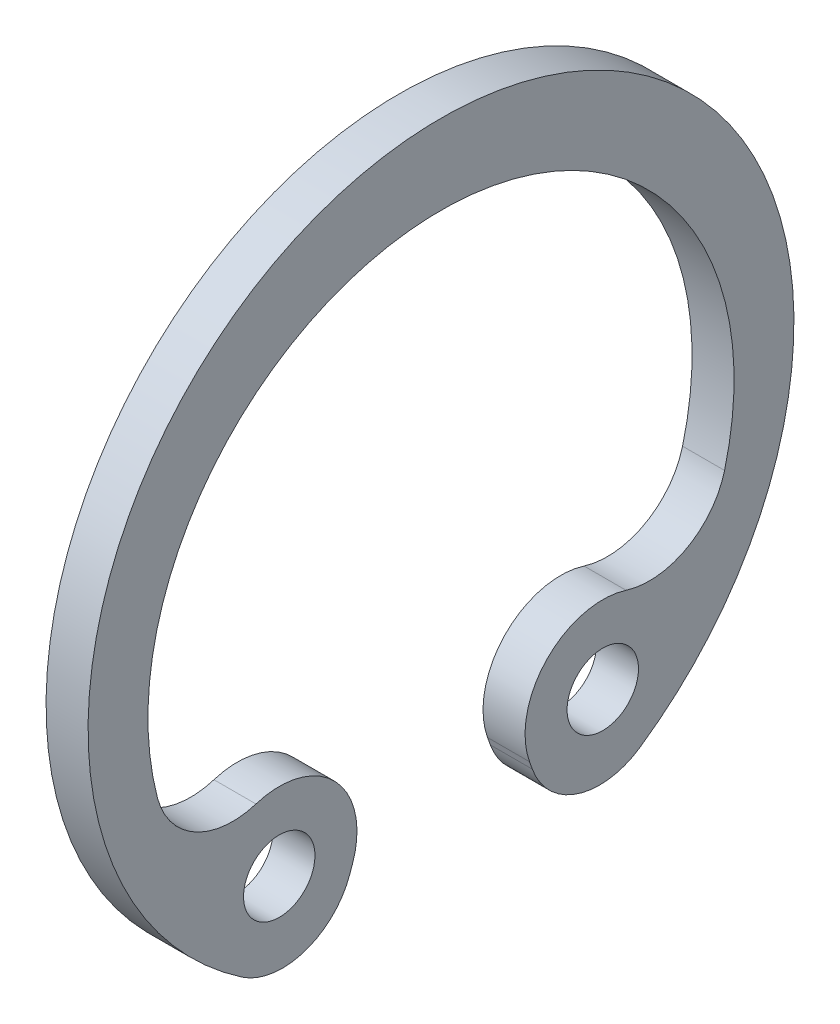
ISO-10303-21;
HEADER;
FILE_DESCRIPTION(('STEP AP214'),'2;1');
FILE_NAME('part.step','',(''),(''),'','','');
FILE_SCHEMA(('AUTOMOTIVE_DESIGN { 1 0 10303 214 1 1 1 1 }'));
ENDSEC;
DATA;
#1=APPLICATION_CONTEXT('core data for automotive mechanical design processes');
#2=APPLICATION_PROTOCOL_DEFINITION('international standard','automotive_design',2000,#1);
#3=PRODUCT_CONTEXT('',#1,'mechanical');
#4=PRODUCT('Part','Part','',(#3));
#5=PRODUCT_RELATED_PRODUCT_CATEGORY('part','',(#4));
#6=PRODUCT_DEFINITION_FORMATION('','',#4);
#7=PRODUCT_DEFINITION_CONTEXT('part definition',#1,'design');
#8=PRODUCT_DEFINITION('design','',#6,#7);
#9=PRODUCT_DEFINITION_SHAPE('','',#8);
#10=(LENGTH_UNIT() NAMED_UNIT(*) SI_UNIT(.MILLI.,.METRE.));
#11=(NAMED_UNIT(*) PLANE_ANGLE_UNIT() SI_UNIT($,.RADIAN.));
#12=(NAMED_UNIT(*) SI_UNIT($,.STERADIAN.) SOLID_ANGLE_UNIT());
#13=UNCERTAINTY_MEASURE_WITH_UNIT(LENGTH_MEASURE(1.E-05),#10,'distance_accuracy_value','');
#14=(GEOMETRIC_REPRESENTATION_CONTEXT(3) GLOBAL_UNCERTAINTY_ASSIGNED_CONTEXT((#13)) GLOBAL_UNIT_ASSIGNED_CONTEXT((#10,
#11,#12)) REPRESENTATION_CONTEXT('',''));
#15=CARTESIAN_POINT('',(0.,0.,0.));
#16=DIRECTION('',(0.,0.,1.));
#17=DIRECTION('',(1.,0.,0.));
#18=AXIS2_PLACEMENT_3D('',#15,#16,#17);
#19=CARTESIAN_POINT('',(0.5,-5.53535632287107,-3.77489475069846));
#20=DIRECTION('',(1.,0.,0.));
#21=DIRECTION('',(0.,0.,-1.));
#22=AXIS2_PLACEMENT_3D('',#19,#20,#21);
#23=PLANE('',#22);
#24=CARTESIAN_POINT('',(0.5,-5.29905651979667,-3.84999999999992));
#25=DIRECTION('',(1.,0.,0.));
#26=DIRECTION('',(0.,0.,-1.));
#27=AXIS2_PLACEMENT_3D('',#24,#25,#26);
#28=CIRCLE('',#27,0.85000000000008);
#29=CARTESIAN_POINT('',(0.5,-5.29905651979667,-4.7));
#30=VERTEX_POINT('',#29);
#31=EDGE_CURVE('E160',#30,#30,#28,.T.);
#32=ORIENTED_EDGE('',*,*,#31,.F.);
#33=EDGE_LOOP('',(#32));
#34=FACE_BOUND('',#33,.T.);
#35=CARTESIAN_POINT('',(0.5,-5.53535632287107,-3.77489475069846));
#36=DIRECTION('',(1.,0.,0.));
#37=DIRECTION('',(0.,0.,-1.));
#38=AXIS2_PLACEMENT_3D('',#35,#36,#37);
#39=CIRCLE('',#38,1.70000000000005);
#40=CARTESIAN_POINT('',(0.5,-6.1054568820179,-2.1733375857928));
#41=VERTEX_POINT('',#40);
#42=CARTESIAN_POINT('',(0.5,-6.9398497182265,-4.7327038665473));
#43=VERTEX_POINT('',#42);
#44=EDGE_CURVE('E163',#41,#43,#39,.T.);
#45=ORIENTED_EDGE('',*,*,#44,.T.);
#46=CARTESIAN_POINT('',(0.5,0.,0.));
#47=DIRECTION('',(1.,0.,0.));
#48=DIRECTION('',(0.,0.,-1.));
#49=AXIS2_PLACEMENT_3D('',#46,#47,#48);
#50=CIRCLE('',#49,8.40000000000001);
#51=CARTESIAN_POINT('',(0.5,-6.9398497182265,4.7327038665473));
#52=VERTEX_POINT('',#51);
#53=EDGE_CURVE('E113',#43,#52,#50,.T.);
#54=ORIENTED_EDGE('',*,*,#53,.T.);
#55=CARTESIAN_POINT('',(0.5,-5.53535632287107,3.77489475069846));
#56=DIRECTION('',(1.,0.,0.));
#57=DIRECTION('',(0.,0.,-1.));
#58=AXIS2_PLACEMENT_3D('',#55,#56,#57);
#59=CIRCLE('',#58,1.70000000000005);
#60=CARTESIAN_POINT('',(0.5,-6.1054568820179,2.1733375857928));
#61=VERTEX_POINT('',#60);
#62=EDGE_CURVE('E166',#52,#61,#59,.T.);
#63=ORIENTED_EDGE('',*,*,#62,.T.);
#64=DIRECTION('',(0.,0.9420924499444,-0.335353270086573));
#65=VECTOR('',#64,1.);
#66=CARTESIAN_POINT('',(0.5,-6.1054568820179,2.1733375857928));
#67=LINE('',#66,#65);
#68=CARTESIAN_POINT('',(0.5,-5.9194600694565,2.1071289676027));
#69=VERTEX_POINT('',#68);
#70=EDGE_CURVE('E168',#61,#69,#67,.T.);
#71=ORIENTED_EDGE('',*,*,#70,.T.);
#72=CARTESIAN_POINT('',(0.5,-5.29905651979667,3.84999999999992));
#73=DIRECTION('',(1.,0.,0.));
#74=DIRECTION('',(0.,0.,-1.));
#75=AXIS2_PLACEMENT_3D('',#72,#73,#74);
#76=CIRCLE('',#75,1.84999999999997);
#77=CARTESIAN_POINT('',(0.5,-3.5340982980784,4.4044569195067));
#78=VERTEX_POINT('',#77);
#79=EDGE_CURVE('E170',#69,#78,#76,.T.);
#80=ORIENTED_EDGE('',*,*,#79,.T.);
#81=CARTESIAN_POINT('',(0.5,-1.76914007636022,4.95891383901346));
#82=DIRECTION('',(-1.,0.,0.));
#83=DIRECTION('',(0.,0.,1.));
#84=AXIS2_PLACEMENT_3D('',#81,#82,#83);
#85=CIRCLE('',#84,1.84999999999987);
#86=CARTESIAN_POINT('',(0.5,-2.2362930795339,6.7489607857792));
#87=VERTEX_POINT('',#86);
#88=EDGE_CURVE('E172',#78,#87,#85,.T.);
#89=ORIENTED_EDGE('',*,*,#88,.T.);
#90=CARTESIAN_POINT('',(0.5,-0.474999999999967,0.));
#91=DIRECTION('',(-1.,0.,0.));
#92=DIRECTION('',(0.,0.,1.));
#93=AXIS2_PLACEMENT_3D('',#90,#91,#92);
#94=CIRCLE('',#93,6.97499999999997);
#95=CARTESIAN_POINT('',(0.5,-2.2362930795339,-6.7489607857792));
#96=VERTEX_POINT('',#95);
#97=EDGE_CURVE('E174',#87,#96,#94,.T.);
#98=ORIENTED_EDGE('',*,*,#97,.T.);
#99=CARTESIAN_POINT('',(0.5,-1.76914007636021,-4.95891383901346));
#100=DIRECTION('',(-1.,0.,0.));
#101=DIRECTION('',(0.,0.,1.));
#102=AXIS2_PLACEMENT_3D('',#99,#100,#101);
#103=CIRCLE('',#102,1.84999999999988);
#104=CARTESIAN_POINT('',(0.5,-3.5340983241193,-4.4044570024006));
#105=VERTEX_POINT('',#104);
#106=EDGE_CURVE('E176',#96,#105,#103,.T.);
#107=ORIENTED_EDGE('',*,*,#106,.T.);
#108=CARTESIAN_POINT('',(0.5,-5.29905651979667,-3.84999999999992));
#109=DIRECTION('',(1.,0.,0.));
#110=DIRECTION('',(0.,0.,-1.));
#111=AXIS2_PLACEMENT_3D('',#108,#109,#110);
#112=CIRCLE('',#111,1.84999999999996);
#113=CARTESIAN_POINT('',(0.5,-5.9194600694565,-2.1071289676027));
#114=VERTEX_POINT('',#113);
#115=EDGE_CURVE('E53',#105,#114,#112,.T.);
#116=ORIENTED_EDGE('',*,*,#115,.T.);
#117=DIRECTION('',(0.,-0.9420924499444,-0.335353270086573));
#118=VECTOR('',#117,1.);
#119=CARTESIAN_POINT('',(0.5,-5.9194600694565,-2.1071289676027));
#120=LINE('',#119,#118);
#121=EDGE_CURVE('E48',#114,#41,#120,.T.);
#122=ORIENTED_EDGE('',*,*,#121,.T.);
#123=EDGE_LOOP('',(#45,#54,#63,#71,#80,#89,#98,#107,#116,#122));
#124=FACE_BOUND('',#123,.T.);
#125=CARTESIAN_POINT('',(0.5,-5.29905651979667,3.84999999999992));
#126=DIRECTION('',(1.,0.,0.));
#127=DIRECTION('',(0.,0.,-1.));
#128=AXIS2_PLACEMENT_3D('',#125,#126,#127);
#129=CIRCLE('',#128,0.849999999999921);
#130=CARTESIAN_POINT('',(0.5,-5.29905651979667,3.));
#131=VERTEX_POINT('',#130);
#132=EDGE_CURVE('E157',#131,#131,#129,.T.);
#133=ORIENTED_EDGE('',*,*,#132,.F.);
#134=EDGE_LOOP('',(#133));
#135=FACE_BOUND('',#134,.T.);
#136=ADVANCED_FACE('F33',(#34,#124,#135),#23,.T.);
#137=CARTESIAN_POINT('',(0.5,-5.53535632287107,-3.77489475069846));
#138=DIRECTION('',(-1.,0.,0.));
#139=DIRECTION('',(0.,0.,1.));
#140=AXIS2_PLACEMENT_3D('',#137,#138,#139);
#141=CYLINDRICAL_SURFACE('',#140,1.70000000000005);
#142=DIRECTION('',(-1.,0.,0.));
#143=VECTOR('',#142,1.);
#144=CARTESIAN_POINT('',(0.5,-6.1054568820179,-2.1733375857928));
#145=LINE('',#144,#143);
#146=CARTESIAN_POINT('',(-0.5,-6.1054568820179,-2.1733375857928));
#147=VERTEX_POINT('',#146);
#148=EDGE_CURVE('E128',#41,#147,#145,.T.);
#149=ORIENTED_EDGE('',*,*,#148,.T.);
#150=CARTESIAN_POINT('',(-0.5,-5.53535632287107,-3.77489475069846));
#151=DIRECTION('',(1.,0.,0.));
#152=DIRECTION('',(0.,0.,-1.));
#153=AXIS2_PLACEMENT_3D('',#150,#151,#152);
#154=CIRCLE('',#153,1.70000000000005);
#155=CARTESIAN_POINT('',(-0.5,-6.9398497182265,-4.7327038665473));
#156=VERTEX_POINT('',#155);
#157=EDGE_CURVE('E122',#147,#156,#154,.T.);
#158=ORIENTED_EDGE('',*,*,#157,.T.);
#159=DIRECTION('',(-1.,0.,0.));
#160=VECTOR('',#159,1.);
#161=CARTESIAN_POINT('',(0.5,-6.9398497182265,-4.7327038665473));
#162=LINE('',#161,#160);
#163=EDGE_CURVE('E11',#43,#156,#162,.T.);
#164=ORIENTED_EDGE('',*,*,#163,.F.);
#165=ORIENTED_EDGE('',*,*,#44,.F.);
#166=EDGE_LOOP('',(#149,#158,#164,#165));
#167=FACE_BOUND('',#166,.T.);
#168=ADVANCED_FACE('F35',(#167),#141,.T.);
#169=CARTESIAN_POINT('',(0.5,0.,0.));
#170=DIRECTION('',(-1.,0.,0.));
#171=DIRECTION('',(0.,0.,1.));
#172=AXIS2_PLACEMENT_3D('',#169,#170,#171);
#173=CYLINDRICAL_SURFACE('',#172,8.40000000000001);
#174=ORIENTED_EDGE('',*,*,#163,.T.);
#175=CARTESIAN_POINT('',(-0.5,0.,0.));
#176=DIRECTION('',(1.,0.,0.));
#177=DIRECTION('',(0.,0.,-1.));
#178=AXIS2_PLACEMENT_3D('',#175,#176,#177);
#179=CIRCLE('',#178,8.40000000000001);
#180=CARTESIAN_POINT('',(-0.5,-6.9398497182265,4.7327038665473));
#181=VERTEX_POINT('',#180);
#182=EDGE_CURVE('E112',#156,#181,#179,.T.);
#183=ORIENTED_EDGE('',*,*,#182,.T.);
#184=DIRECTION('',(-1.,0.,0.));
#185=VECTOR('',#184,1.);
#186=CARTESIAN_POINT('',(0.5,-6.9398497182265,4.7327038665473));
#187=LINE('',#186,#185);
#188=EDGE_CURVE('E41',#52,#181,#187,.T.);
#189=ORIENTED_EDGE('',*,*,#188,.F.);
#190=ORIENTED_EDGE('',*,*,#53,.F.);
#191=EDGE_LOOP('',(#174,#183,#189,#190));
#192=FACE_BOUND('',#191,.T.);
#193=ADVANCED_FACE('F110',(#192),#173,.T.);
#194=CARTESIAN_POINT('',(0.5,-5.53535632287107,3.77489475069846));
#195=DIRECTION('',(-1.,0.,0.));
#196=DIRECTION('',(0.,0.,1.));
#197=AXIS2_PLACEMENT_3D('',#194,#195,#196);
#198=CYLINDRICAL_SURFACE('',#197,1.70000000000005);
#199=ORIENTED_EDGE('',*,*,#188,.T.);
#200=CARTESIAN_POINT('',(-0.5,-5.53535632287107,3.77489475069846));
#201=DIRECTION('',(1.,0.,0.));
#202=DIRECTION('',(0.,0.,-1.));
#203=AXIS2_PLACEMENT_3D('',#200,#201,#202);
#204=CIRCLE('',#203,1.70000000000005);
#205=CARTESIAN_POINT('',(-0.5,-6.1054568820179,2.1733375857928));
#206=VERTEX_POINT('',#205);
#207=EDGE_CURVE('E126',#181,#206,#204,.T.);
#208=ORIENTED_EDGE('',*,*,#207,.T.);
#209=DIRECTION('',(-1.,0.,0.));
#210=VECTOR('',#209,1.);
#211=CARTESIAN_POINT('',(0.5,-6.1054568820179,2.1733375857928));
#212=LINE('',#211,#210);
#213=EDGE_CURVE('E193',#61,#206,#212,.T.);
#214=ORIENTED_EDGE('',*,*,#213,.F.);
#215=ORIENTED_EDGE('',*,*,#62,.F.);
#216=EDGE_LOOP('',(#199,#208,#214,#215));
#217=FACE_BOUND('',#216,.T.);
#218=ADVANCED_FACE('F196',(#217),#198,.T.);
#219=CARTESIAN_POINT('',(0.5,-6.1054568820179,2.1733375857928));
#220=DIRECTION('',(0.,0.335353270086573,0.9420924499444));
#221=DIRECTION('',(0.,-0.9420924499444,0.335353270086573));
#222=AXIS2_PLACEMENT_3D('',#219,#220,#221);
#223=PLANE('',#222);
#224=ORIENTED_EDGE('',*,*,#213,.T.);
#225=DIRECTION('',(0.,0.9420924499444,-0.335353270086573));
#226=VECTOR('',#225,1.);
#227=CARTESIAN_POINT('',(-0.5,-6.1054568820179,2.1733375857928));
#228=LINE('',#227,#226);
#229=CARTESIAN_POINT('',(-0.5,-5.9194600694565,2.1071289676027));
#230=VERTEX_POINT('',#229);
#231=EDGE_CURVE('E137',#206,#230,#228,.T.);
#232=ORIENTED_EDGE('',*,*,#231,.T.);
#233=DIRECTION('',(-1.,0.,0.));
#234=VECTOR('',#233,1.);
#235=CARTESIAN_POINT('',(0.5,-5.9194600694565,2.1071289676027));
#236=LINE('',#235,#234);
#237=EDGE_CURVE('E191',#69,#230,#236,.T.);
#238=ORIENTED_EDGE('',*,*,#237,.F.);
#239=ORIENTED_EDGE('',*,*,#70,.F.);
#240=EDGE_LOOP('',(#224,#232,#238,#239));
#241=FACE_BOUND('',#240,.T.);
#242=ADVANCED_FACE('F204',(#241),#223,.F.);
#243=CARTESIAN_POINT('',(0.5,-5.29905651979667,3.84999999999992));
#244=DIRECTION('',(-1.,0.,0.));
#245=DIRECTION('',(0.,0.,1.));
#246=AXIS2_PLACEMENT_3D('',#243,#244,#245);
#247=CYLINDRICAL_SURFACE('',#246,1.84999999999997);
#248=ORIENTED_EDGE('',*,*,#237,.T.);
#249=CARTESIAN_POINT('',(-0.5,-5.29905651979667,3.84999999999992));
#250=DIRECTION('',(1.,0.,0.));
#251=DIRECTION('',(0.,0.,-1.));
#252=AXIS2_PLACEMENT_3D('',#249,#250,#251);
#253=CIRCLE('',#252,1.84999999999997);
#254=CARTESIAN_POINT('',(-0.5,-3.5340982980784,4.4044569195067));
#255=VERTEX_POINT('',#254);
#256=EDGE_CURVE('E140',#230,#255,#253,.T.);
#257=ORIENTED_EDGE('',*,*,#256,.T.);
#258=DIRECTION('',(-1.,0.,0.));
#259=VECTOR('',#258,1.);
#260=CARTESIAN_POINT('',(0.5,-3.5340982980784,4.4044569195067));
#261=LINE('',#260,#259);
#262=EDGE_CURVE('E189',#78,#255,#261,.T.);
#263=ORIENTED_EDGE('',*,*,#262,.F.);
#264=ORIENTED_EDGE('',*,*,#79,.F.);
#265=EDGE_LOOP('',(#248,#257,#263,#264));
#266=FACE_BOUND('',#265,.T.);
#267=ADVANCED_FACE('F207',(#266),#247,.T.);
#268=CARTESIAN_POINT('',(0.5,-1.76914007636022,4.95891383901346));
#269=DIRECTION('',(-1.,0.,0.));
#270=DIRECTION('',(0.,0.,1.));
#271=AXIS2_PLACEMENT_3D('',#268,#269,#270);
#272=CYLINDRICAL_SURFACE('',#271,1.84999999999987);
#273=ORIENTED_EDGE('',*,*,#262,.T.);
#274=CARTESIAN_POINT('',(-0.5,-1.76914007636022,4.95891383901346));
#275=DIRECTION('',(-1.,0.,0.));
#276=DIRECTION('',(0.,0.,1.));
#277=AXIS2_PLACEMENT_3D('',#274,#275,#276);
#278=CIRCLE('',#277,1.84999999999987);
#279=CARTESIAN_POINT('',(-0.5,-2.2362930795339,6.7489607857792));
#280=VERTEX_POINT('',#279);
#281=EDGE_CURVE('E143',#255,#280,#278,.T.);
#282=ORIENTED_EDGE('',*,*,#281,.T.);
#283=DIRECTION('',(-1.,0.,0.));
#284=VECTOR('',#283,1.);
#285=CARTESIAN_POINT('',(0.5,-2.2362930795339,6.7489607857792));
#286=LINE('',#285,#284);
#287=EDGE_CURVE('E187',#87,#280,#286,.T.);
#288=ORIENTED_EDGE('',*,*,#287,.F.);
#289=ORIENTED_EDGE('',*,*,#88,.F.);
#290=EDGE_LOOP('',(#273,#282,#288,#289));
#291=FACE_BOUND('',#290,.T.);
#292=ADVANCED_FACE('F212',(#291),#272,.F.);
#293=CARTESIAN_POINT('',(0.5,-0.474999999999967,0.));
#294=DIRECTION('',(-1.,0.,0.));
#295=DIRECTION('',(0.,0.,1.));
#296=AXIS2_PLACEMENT_3D('',#293,#294,#295);
#297=CYLINDRICAL_SURFACE('',#296,6.97499999999997);
#298=ORIENTED_EDGE('',*,*,#287,.T.);
#299=CARTESIAN_POINT('',(-0.5,-0.474999999999967,0.));
#300=DIRECTION('',(-1.,0.,0.));
#301=DIRECTION('',(0.,0.,1.));
#302=AXIS2_PLACEMENT_3D('',#299,#300,#301);
#303=CIRCLE('',#302,6.97499999999997);
#304=CARTESIAN_POINT('',(-0.5,-2.2362930795339,-6.7489607857792));
#305=VERTEX_POINT('',#304);
#306=EDGE_CURVE('E146',#280,#305,#303,.T.);
#307=ORIENTED_EDGE('',*,*,#306,.T.);
#308=DIRECTION('',(-1.,0.,0.));
#309=VECTOR('',#308,1.);
#310=CARTESIAN_POINT('',(0.5,-2.2362930795339,-6.7489607857792));
#311=LINE('',#310,#309);
#312=EDGE_CURVE('E185',#96,#305,#311,.T.);
#313=ORIENTED_EDGE('',*,*,#312,.F.);
#314=ORIENTED_EDGE('',*,*,#97,.F.);
#315=EDGE_LOOP('',(#298,#307,#313,#314));
#316=FACE_BOUND('',#315,.T.);
#317=ADVANCED_FACE('F218',(#316),#297,.F.);
#318=CARTESIAN_POINT('',(0.5,-1.76914007636021,-4.95891383901346));
#319=DIRECTION('',(-1.,0.,0.));
#320=DIRECTION('',(0.,0.,1.));
#321=AXIS2_PLACEMENT_3D('',#318,#319,#320);
#322=CYLINDRICAL_SURFACE('',#321,1.84999999999988);
#323=ORIENTED_EDGE('',*,*,#312,.T.);
#324=CARTESIAN_POINT('',(-0.5,-1.76914007636021,-4.95891383901346));
#325=DIRECTION('',(-1.,0.,0.));
#326=DIRECTION('',(0.,0.,1.));
#327=AXIS2_PLACEMENT_3D('',#324,#325,#326);
#328=CIRCLE('',#327,1.84999999999988);
#329=CARTESIAN_POINT('',(-0.5,-3.5340983241193,-4.4044570024006));
#330=VERTEX_POINT('',#329);
#331=EDGE_CURVE('E149',#305,#330,#328,.T.);
#332=ORIENTED_EDGE('',*,*,#331,.T.);
#333=DIRECTION('',(-1.,0.,0.));
#334=VECTOR('',#333,1.);
#335=CARTESIAN_POINT('',(0.5,-3.5340983241193,-4.4044570024006));
#336=LINE('',#335,#334);
#337=EDGE_CURVE('E183',#105,#330,#336,.T.);
#338=ORIENTED_EDGE('',*,*,#337,.F.);
#339=ORIENTED_EDGE('',*,*,#106,.F.);
#340=EDGE_LOOP('',(#323,#332,#338,#339));
#341=FACE_BOUND('',#340,.T.);
#342=ADVANCED_FACE('F222',(#341),#322,.F.);
#343=CARTESIAN_POINT('',(0.5,-5.29905651979667,-3.84999999999992));
#344=DIRECTION('',(-1.,0.,0.));
#345=DIRECTION('',(0.,0.,1.));
#346=AXIS2_PLACEMENT_3D('',#343,#344,#345);
#347=CYLINDRICAL_SURFACE('',#346,1.84999999999996);
#348=ORIENTED_EDGE('',*,*,#337,.T.);
#349=CARTESIAN_POINT('',(-0.5,-5.29905651979667,-3.84999999999992));
#350=DIRECTION('',(1.,0.,0.));
#351=DIRECTION('',(0.,0.,-1.));
#352=AXIS2_PLACEMENT_3D('',#349,#350,#351);
#353=CIRCLE('',#352,1.84999999999996);
#354=CARTESIAN_POINT('',(-0.5,-5.9194600694565,-2.1071289676027));
#355=VERTEX_POINT('',#354);
#356=EDGE_CURVE('E152',#330,#355,#353,.T.);
#357=ORIENTED_EDGE('',*,*,#356,.T.);
#358=DIRECTION('',(-1.,0.,0.));
#359=VECTOR('',#358,1.);
#360=CARTESIAN_POINT('',(0.5,-5.9194600694565,-2.1071289676027));
#361=LINE('',#360,#359);
#362=EDGE_CURVE('E181',#114,#355,#361,.T.);
#363=ORIENTED_EDGE('',*,*,#362,.F.);
#364=ORIENTED_EDGE('',*,*,#115,.F.);
#365=EDGE_LOOP('',(#348,#357,#363,#364));
#366=FACE_BOUND('',#365,.T.);
#367=ADVANCED_FACE('F225',(#366),#347,.T.);
#368=CARTESIAN_POINT('',(0.5,-5.9194600694565,-2.1071289676027));
#369=DIRECTION('',(0.,0.335353270086573,-0.9420924499444));
#370=DIRECTION('',(0.,0.9420924499444,0.335353270086573));
#371=AXIS2_PLACEMENT_3D('',#368,#369,#370);
#372=PLANE('',#371);
#373=ORIENTED_EDGE('',*,*,#362,.T.);
#374=DIRECTION('',(0.,-0.9420924499444,-0.335353270086573));
#375=VECTOR('',#374,1.);
#376=CARTESIAN_POINT('',(-0.5,-5.9194600694565,-2.1071289676027));
#377=LINE('',#376,#375);
#378=EDGE_CURVE('E155',#355,#147,#377,.T.);
#379=ORIENTED_EDGE('',*,*,#378,.T.);
#380=ORIENTED_EDGE('',*,*,#148,.F.);
#381=ORIENTED_EDGE('',*,*,#121,.F.);
#382=EDGE_LOOP('',(#373,#379,#380,#381));
#383=FACE_BOUND('',#382,.T.);
#384=ADVANCED_FACE('F227',(#383),#372,.F.);
#385=CARTESIAN_POINT('',(0.5,-5.29905651979667,-3.84999999999992));
#386=DIRECTION('',(-1.,0.,0.));
#387=DIRECTION('',(0.,0.,1.));
#388=AXIS2_PLACEMENT_3D('',#385,#386,#387);
#389=CYLINDRICAL_SURFACE('',#388,0.85000000000008);
#390=ORIENTED_EDGE('',*,*,#31,.T.);
#391=EDGE_LOOP('',(#390));
#392=FACE_BOUND('',#391,.T.);
#393=CARTESIAN_POINT('',(-0.5,-5.29905651979667,-3.84999999999992));
#394=DIRECTION('',(1.,0.,0.));
#395=DIRECTION('',(0.,0.,-1.));
#396=AXIS2_PLACEMENT_3D('',#393,#394,#395);
#397=CIRCLE('',#396,0.85000000000008);
#398=CARTESIAN_POINT('',(-0.5,-5.29905651979667,-4.7));
#399=VERTEX_POINT('',#398);
#400=EDGE_CURVE('E129',#399,#399,#397,.T.);
#401=ORIENTED_EDGE('',*,*,#400,.F.);
#402=EDGE_LOOP('',(#401));
#403=FACE_BOUND('',#402,.T.);
#404=ADVANCED_FACE('F229',(#392,#403),#389,.F.);
#405=CARTESIAN_POINT('',(0.5,-5.29905651979667,3.84999999999992));
#406=DIRECTION('',(-1.,0.,0.));
#407=DIRECTION('',(0.,0.,1.));
#408=AXIS2_PLACEMENT_3D('',#405,#406,#407);
#409=CYLINDRICAL_SURFACE('',#408,0.849999999999921);
#410=ORIENTED_EDGE('',*,*,#132,.T.);
#411=EDGE_LOOP('',(#410));
#412=FACE_BOUND('',#411,.T.);
#413=CARTESIAN_POINT('',(-0.5,-5.29905651979667,3.84999999999992));
#414=DIRECTION('',(1.,0.,0.));
#415=DIRECTION('',(0.,0.,-1.));
#416=AXIS2_PLACEMENT_3D('',#413,#414,#415);
#417=CIRCLE('',#416,0.849999999999921);
#418=CARTESIAN_POINT('',(-0.5,-5.29905651979667,3.));
#419=VERTEX_POINT('',#418);
#420=EDGE_CURVE('E132',#419,#419,#417,.T.);
#421=ORIENTED_EDGE('',*,*,#420,.F.);
#422=EDGE_LOOP('',(#421));
#423=FACE_BOUND('',#422,.T.);
#424=ADVANCED_FACE('F235',(#412,#423),#409,.F.);
#425=CARTESIAN_POINT('',(-0.5,-5.53535632287107,-3.77489475069846));
#426=DIRECTION('',(1.,0.,0.));
#427=DIRECTION('',(0.,0.,-1.));
#428=AXIS2_PLACEMENT_3D('',#425,#426,#427);
#429=PLANE('',#428);
#430=ORIENTED_EDGE('',*,*,#420,.T.);
#431=EDGE_LOOP('',(#430));
#432=FACE_BOUND('',#431,.T.);
#433=ORIENTED_EDGE('',*,*,#400,.T.);
#434=EDGE_LOOP('',(#433));
#435=FACE_BOUND('',#434,.T.);
#436=ORIENTED_EDGE('',*,*,#157,.F.);
#437=ORIENTED_EDGE('',*,*,#378,.F.);
#438=ORIENTED_EDGE('',*,*,#356,.F.);
#439=ORIENTED_EDGE('',*,*,#331,.F.);
#440=ORIENTED_EDGE('',*,*,#306,.F.);
#441=ORIENTED_EDGE('',*,*,#281,.F.);
#442=ORIENTED_EDGE('',*,*,#256,.F.);
#443=ORIENTED_EDGE('',*,*,#231,.F.);
#444=ORIENTED_EDGE('',*,*,#207,.F.);
#445=ORIENTED_EDGE('',*,*,#182,.F.);
#446=EDGE_LOOP('',(#436,#437,#438,#439,#440,#441,#442,#443,#444,#445));
#447=FACE_BOUND('',#446,.T.);
#448=ADVANCED_FACE('F120',(#432,#435,#447),#429,.F.);
#449=CLOSED_SHELL('',(#136,#168,#193,#218,#242,#267,#292,#317,#342,#367,#384,#404,#424,#448));
#450=MANIFOLD_SOLID_BREP('B2',#449);
#451=ADVANCED_BREP_SHAPE_REPRESENTATION('',(#18,#450),#14);
#452=SHAPE_DEFINITION_REPRESENTATION(#9,#451);
ENDSEC;
END-ISO-10303-21;
